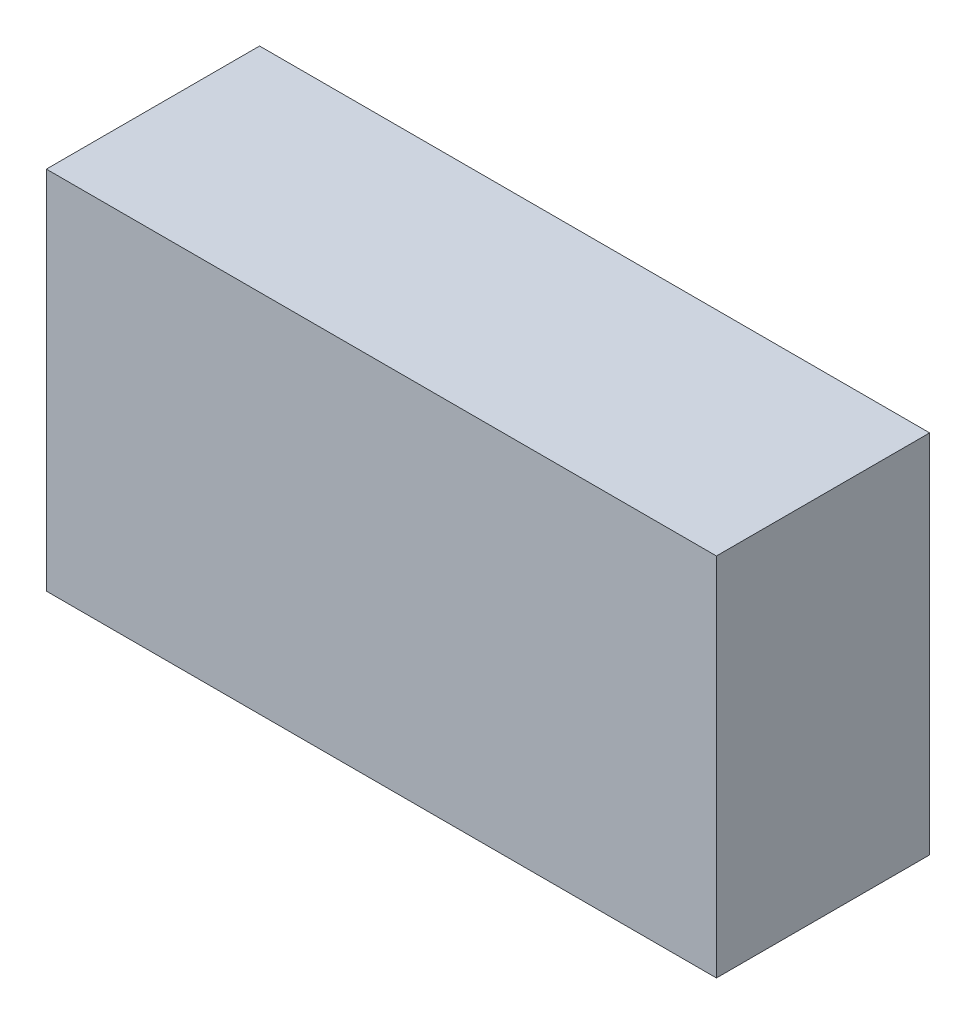
ISO-10303-21;
HEADER;
FILE_DESCRIPTION(('STEP AP214'),'2;1');
FILE_NAME('part.step','',(''),(''),'','','');
FILE_SCHEMA(('AUTOMOTIVE_DESIGN { 1 0 10303 214 1 1 1 1 }'));
ENDSEC;
DATA;
#1=APPLICATION_CONTEXT('core data for automotive mechanical design processes');
#2=APPLICATION_PROTOCOL_DEFINITION('international standard','automotive_design',2000,#1);
#3=PRODUCT_CONTEXT('',#1,'mechanical');
#4=PRODUCT('Part','Part','',(#3));
#5=PRODUCT_RELATED_PRODUCT_CATEGORY('part','',(#4));
#6=PRODUCT_DEFINITION_FORMATION('','',#4);
#7=PRODUCT_DEFINITION_CONTEXT('part definition',#1,'design');
#8=PRODUCT_DEFINITION('design','',#6,#7);
#9=PRODUCT_DEFINITION_SHAPE('','',#8);
#10=(LENGTH_UNIT() NAMED_UNIT(*) SI_UNIT(.MILLI.,.METRE.));
#11=(NAMED_UNIT(*) PLANE_ANGLE_UNIT() SI_UNIT($,.RADIAN.));
#12=(NAMED_UNIT(*) SI_UNIT($,.STERADIAN.) SOLID_ANGLE_UNIT());
#13=UNCERTAINTY_MEASURE_WITH_UNIT(LENGTH_MEASURE(1.E-05),#10,'distance_accuracy_value','');
#14=(GEOMETRIC_REPRESENTATION_CONTEXT(3) GLOBAL_UNCERTAINTY_ASSIGNED_CONTEXT((#13)) GLOBAL_UNIT_ASSIGNED_CONTEXT((#10,
#11,#12)) REPRESENTATION_CONTEXT('',''));
#15=CARTESIAN_POINT('',(0.,0.,0.));
#16=DIRECTION('',(0.,0.,1.));
#17=DIRECTION('',(1.,0.,0.));
#18=AXIS2_PLACEMENT_3D('',#15,#16,#17);
#19=CARTESIAN_POINT('',(55.,30.,35.));
#20=DIRECTION('',(-1.,0.,0.));
#21=DIRECTION('',(0.,-1.,0.));
#22=AXIS2_PLACEMENT_3D('',#19,#20,#21);
#23=PLANE('',#22);
#24=DIRECTION('',(0.,1.,0.));
#25=VECTOR('',#24,1.);
#26=CARTESIAN_POINT('',(55.,30.,0.));
#27=LINE('',#26,#25);
#28=CARTESIAN_POINT('',(55.,-30.,0.));
#29=VERTEX_POINT('',#28);
#30=CARTESIAN_POINT('',(55.,30.,0.));
#31=VERTEX_POINT('',#30);
#32=EDGE_CURVE('E173',#29,#31,#27,.T.);
#33=ORIENTED_EDGE('',*,*,#32,.T.);
#34=DIRECTION('',(0.,0.,-1.));
#35=VECTOR('',#34,1.);
#36=CARTESIAN_POINT('',(55.,30.,35.));
#37=LINE('',#36,#35);
#38=CARTESIAN_POINT('',(55.,30.,35.));
#39=VERTEX_POINT('',#38);
#40=EDGE_CURVE('E191',#39,#31,#37,.T.);
#41=ORIENTED_EDGE('',*,*,#40,.F.);
#42=DIRECTION('',(0.,1.,0.));
#43=VECTOR('',#42,1.);
#44=CARTESIAN_POINT('',(55.,30.,35.));
#45=LINE('',#44,#43);
#46=CARTESIAN_POINT('',(55.,-30.,35.));
#47=VERTEX_POINT('',#46);
#48=EDGE_CURVE('E179',#47,#39,#45,.T.);
#49=ORIENTED_EDGE('',*,*,#48,.F.);
#50=DIRECTION('',(0.,0.,-1.));
#51=VECTOR('',#50,1.);
#52=CARTESIAN_POINT('',(55.,-30.,35.));
#53=LINE('',#52,#51);
#54=EDGE_CURVE('E180',#47,#29,#53,.T.);
#55=ORIENTED_EDGE('',*,*,#54,.T.);
#56=EDGE_LOOP('',(#33,#41,#49,#55));
#57=FACE_BOUND('',#56,.T.);
#58=ADVANCED_FACE('F39',(#57),#23,.F.);
#59=CARTESIAN_POINT('',(-55.,30.,35.));
#60=DIRECTION('',(0.,-1.,0.));
#61=DIRECTION('',(0.,0.,-1.));
#62=AXIS2_PLACEMENT_3D('',#59,#60,#61);
#63=PLANE('',#62);
#64=DIRECTION('',(-1.,0.,0.));
#65=VECTOR('',#64,1.);
#66=CARTESIAN_POINT('',(-55.,30.,0.));
#67=LINE('',#66,#65);
#68=CARTESIAN_POINT('',(-55.,30.,0.));
#69=VERTEX_POINT('',#68);
#70=EDGE_CURVE('E169',#31,#69,#67,.T.);
#71=ORIENTED_EDGE('',*,*,#70,.T.);
#72=DIRECTION('',(0.,0.,-1.));
#73=VECTOR('',#72,1.);
#74=CARTESIAN_POINT('',(-55.,30.,35.));
#75=LINE('',#74,#73);
#76=CARTESIAN_POINT('',(-55.,30.,35.));
#77=VERTEX_POINT('',#76);
#78=EDGE_CURVE('E188',#77,#69,#75,.T.);
#79=ORIENTED_EDGE('',*,*,#78,.F.);
#80=DIRECTION('',(-1.,0.,0.));
#81=VECTOR('',#80,1.);
#82=CARTESIAN_POINT('',(-55.,30.,35.));
#83=LINE('',#82,#81);
#84=EDGE_CURVE('E282',#39,#77,#83,.T.);
#85=ORIENTED_EDGE('',*,*,#84,.F.);
#86=ORIENTED_EDGE('',*,*,#40,.T.);
#87=EDGE_LOOP('',(#71,#79,#85,#86));
#88=FACE_BOUND('',#87,.T.);
#89=ADVANCED_FACE('F297',(#88),#63,.F.);
#90=CARTESIAN_POINT('',(-55.,30.,35.));
#91=DIRECTION('',(1.,0.,0.));
#92=DIRECTION('',(0.,1.,0.));
#93=AXIS2_PLACEMENT_3D('',#90,#91,#92);
#94=PLANE('',#93);
#95=DIRECTION('',(0.,-1.,0.));
#96=VECTOR('',#95,1.);
#97=CARTESIAN_POINT('',(-55.,0.,7.));
#98=LINE('',#97,#96);
#99=CARTESIAN_POINT('',(-55.,15.,7.));
#100=VERTEX_POINT('',#99);
#101=CARTESIAN_POINT('',(-55.,10.,7.));
#102=VERTEX_POINT('',#101);
#103=EDGE_CURVE('E426',#100,#102,#98,.T.);
#104=ORIENTED_EDGE('',*,*,#103,.F.);
#105=DIRECTION('',(0.,0.,-1.));
#106=VECTOR('',#105,1.);
#107=CARTESIAN_POINT('',(-55.,15.,0.));
#108=LINE('',#107,#106);
#109=CARTESIAN_POINT('',(-55.,15.,16.));
#110=VERTEX_POINT('',#109);
#111=EDGE_CURVE('E54',#110,#100,#108,.T.);
#112=ORIENTED_EDGE('',*,*,#111,.F.);
#113=DIRECTION('',(0.,-1.,0.));
#114=VECTOR('',#113,1.);
#115=CARTESIAN_POINT('',(-55.,0.,16.));
#116=LINE('',#115,#114);
#117=CARTESIAN_POINT('',(-55.,10.,16.));
#118=VERTEX_POINT('',#117);
#119=EDGE_CURVE('E217',#110,#118,#116,.T.);
#120=ORIENTED_EDGE('',*,*,#119,.T.);
#121=DIRECTION('',(0.,0.,-1.));
#122=VECTOR('',#121,1.);
#123=CARTESIAN_POINT('',(-55.,10.,0.));
#124=LINE('',#123,#122);
#125=EDGE_CURVE('E226',#118,#102,#124,.T.);
#126=ORIENTED_EDGE('',*,*,#125,.T.);
#127=EDGE_LOOP('',(#104,#112,#120,#126));
#128=FACE_BOUND('',#127,.T.);
#129=DIRECTION('',(0.,-1.,0.));
#130=VECTOR('',#129,1.);
#131=CARTESIAN_POINT('',(-55.,30.,0.));
#132=LINE('',#131,#130);
#133=CARTESIAN_POINT('',(-55.,-10.5,0.));
#134=VERTEX_POINT('',#133);
#135=EDGE_CURVE('E159',#69,#134,#132,.T.);
#136=ORIENTED_EDGE('',*,*,#135,.T.);
#137=CARTESIAN_POINT('',(-55.,-13.,0.));
#138=DIRECTION('',(-1.,0.,0.));
#139=DIRECTION('',(0.,-1.,0.));
#140=AXIS2_PLACEMENT_3D('',#137,#138,#139);
#141=CIRCLE('',#140,2.5);
#142=CARTESIAN_POINT('',(-55.,-15.5,0.));
#143=VERTEX_POINT('',#142);
#144=EDGE_CURVE('E142',#143,#134,#141,.T.);
#145=ORIENTED_EDGE('',*,*,#144,.F.);
#146=CARTESIAN_POINT('',(-55.,-30.,0.));
#147=VERTEX_POINT('',#146);
#148=EDGE_CURVE('E155',#143,#147,#132,.T.);
#149=ORIENTED_EDGE('',*,*,#148,.T.);
#150=DIRECTION('',(0.,0.,-1.));
#151=VECTOR('',#150,1.);
#152=CARTESIAN_POINT('',(-55.,-30.,35.));
#153=LINE('',#152,#151);
#154=CARTESIAN_POINT('',(-55.,-30.,35.));
#155=VERTEX_POINT('',#154);
#156=EDGE_CURVE('E184',#155,#147,#153,.T.);
#157=ORIENTED_EDGE('',*,*,#156,.F.);
#158=DIRECTION('',(0.,-1.,0.));
#159=VECTOR('',#158,1.);
#160=CARTESIAN_POINT('',(-55.,30.,35.));
#161=LINE('',#160,#159);
#162=EDGE_CURVE('E285',#77,#155,#161,.T.);
#163=ORIENTED_EDGE('',*,*,#162,.F.);
#164=ORIENTED_EDGE('',*,*,#78,.T.);
#165=EDGE_LOOP('',(#136,#145,#149,#157,#163,#164));
#166=FACE_BOUND('',#165,.T.);
#167=ADVANCED_FACE('F153',(#128,#166),#94,.F.);
#168=CARTESIAN_POINT('',(-55.,-30.,35.));
#169=DIRECTION('',(0.,1.,0.));
#170=DIRECTION('',(0.,0.,1.));
#171=AXIS2_PLACEMENT_3D('',#168,#169,#170);
#172=PLANE('',#171);
#173=DIRECTION('',(1.,0.,0.));
#174=VECTOR('',#173,1.);
#175=CARTESIAN_POINT('',(-55.,-30.,0.));
#176=LINE('',#175,#174);
#177=EDGE_CURVE('E167',#147,#29,#176,.T.);
#178=ORIENTED_EDGE('',*,*,#177,.T.);
#179=ORIENTED_EDGE('',*,*,#54,.F.);
#180=DIRECTION('',(1.,0.,0.));
#181=VECTOR('',#180,1.);
#182=CARTESIAN_POINT('',(-55.,-30.,35.));
#183=LINE('',#182,#181);
#184=EDGE_CURVE('E185',#155,#47,#183,.T.);
#185=ORIENTED_EDGE('',*,*,#184,.F.);
#186=ORIENTED_EDGE('',*,*,#156,.T.);
#187=EDGE_LOOP('',(#178,#179,#185,#186));
#188=FACE_BOUND('',#187,.T.);
#189=ADVANCED_FACE('F303',(#188),#172,.F.);
#190=CARTESIAN_POINT('',(0.,0.,35.));
#191=DIRECTION('',(0.,0.,1.));
#192=DIRECTION('',(1.,0.,0.));
#193=AXIS2_PLACEMENT_3D('',#190,#191,#192);
#194=PLANE('',#193);
#195=ORIENTED_EDGE('',*,*,#48,.T.);
#196=ORIENTED_EDGE('',*,*,#84,.T.);
#197=ORIENTED_EDGE('',*,*,#162,.T.);
#198=ORIENTED_EDGE('',*,*,#184,.T.);
#199=EDGE_LOOP('',(#195,#196,#197,#198));
#200=FACE_BOUND('',#199,.T.);
#201=ADVANCED_FACE('F300',(#200),#194,.T.);
#202=CARTESIAN_POINT('',(0.,0.,0.));
#203=DIRECTION('',(0.,0.,1.));
#204=DIRECTION('',(1.,0.,0.));
#205=AXIS2_PLACEMENT_3D('',#202,#203,#204);
#206=PLANE('',#205);
#207=DIRECTION('',(0.,-1.,0.));
#208=VECTOR('',#207,1.);
#209=CARTESIAN_POINT('',(-53.5,30.,0.));
#210=LINE('',#209,#208);
#211=CARTESIAN_POINT('',(-53.5,28.5,0.));
#212=VERTEX_POINT('',#211);
#213=CARTESIAN_POINT('',(-53.5,-10.5,0.));
#214=VERTEX_POINT('',#213);
#215=EDGE_CURVE('E272',#212,#214,#210,.T.);
#216=ORIENTED_EDGE('',*,*,#215,.T.);
#217=DIRECTION('',(-1.,0.,0.));
#218=VECTOR('',#217,1.);
#219=CARTESIAN_POINT('',(-20.,-10.5,0.));
#220=LINE('',#219,#218);
#221=EDGE_CURVE('E149',#214,#134,#220,.T.);
#222=ORIENTED_EDGE('',*,*,#221,.T.);
#223=ORIENTED_EDGE('',*,*,#135,.F.);
#224=ORIENTED_EDGE('',*,*,#70,.F.);
#225=ORIENTED_EDGE('',*,*,#32,.F.);
#226=ORIENTED_EDGE('',*,*,#177,.F.);
#227=ORIENTED_EDGE('',*,*,#148,.F.);
#228=DIRECTION('',(-1.,0.,0.));
#229=VECTOR('',#228,1.);
#230=CARTESIAN_POINT('',(-20.,-15.5,0.));
#231=LINE('',#230,#229);
#232=CARTESIAN_POINT('',(-53.5,-15.5,0.));
#233=VERTEX_POINT('',#232);
#234=EDGE_CURVE('E139',#233,#143,#231,.T.);
#235=ORIENTED_EDGE('',*,*,#234,.F.);
#236=CARTESIAN_POINT('',(-53.5,-28.5,0.));
#237=VERTEX_POINT('',#236);
#238=EDGE_CURVE('E275',#233,#237,#210,.T.);
#239=ORIENTED_EDGE('',*,*,#238,.T.);
#240=DIRECTION('',(1.,0.,0.));
#241=VECTOR('',#240,1.);
#242=CARTESIAN_POINT('',(-55.,-28.5,0.));
#243=LINE('',#242,#241);
#244=CARTESIAN_POINT('',(53.5,-28.5,0.));
#245=VERTEX_POINT('',#244);
#246=EDGE_CURVE('E245',#237,#245,#243,.T.);
#247=ORIENTED_EDGE('',*,*,#246,.T.);
#248=DIRECTION('',(0.,1.,0.));
#249=VECTOR('',#248,1.);
#250=CARTESIAN_POINT('',(53.5,30.,0.));
#251=LINE('',#250,#249);
#252=CARTESIAN_POINT('',(53.5,28.5,0.));
#253=VERTEX_POINT('',#252);
#254=EDGE_CURVE('E264',#245,#253,#251,.T.);
#255=ORIENTED_EDGE('',*,*,#254,.T.);
#256=DIRECTION('',(-1.,0.,0.));
#257=VECTOR('',#256,1.);
#258=CARTESIAN_POINT('',(-55.,28.5,0.));
#259=LINE('',#258,#257);
#260=EDGE_CURVE('E268',#253,#212,#259,.T.);
#261=ORIENTED_EDGE('',*,*,#260,.T.);
#262=EDGE_LOOP('',(#216,#222,#223,#224,#225,#226,#227,#235,#239,#247,#255,#261));
#263=FACE_BOUND('',#262,.T.);
#264=ADVANCED_FACE('F165',(#263),#206,.F.);
#265=CARTESIAN_POINT('',(53.5,30.,35.));
#266=DIRECTION('',(-1.,0.,0.));
#267=DIRECTION('',(0.,-1.,0.));
#268=AXIS2_PLACEMENT_3D('',#265,#266,#267);
#269=PLANE('',#268);
#270=ORIENTED_EDGE('',*,*,#254,.F.);
#271=DIRECTION('',(0.,0.,-1.));
#272=VECTOR('',#271,1.);
#273=CARTESIAN_POINT('',(53.5,-28.5,35.));
#274=LINE('',#273,#272);
#275=CARTESIAN_POINT('',(53.5,-28.5,33.5));
#276=VERTEX_POINT('',#275);
#277=EDGE_CURVE('E246',#276,#245,#274,.T.);
#278=ORIENTED_EDGE('',*,*,#277,.F.);
#279=DIRECTION('',(0.,1.,0.));
#280=VECTOR('',#279,1.);
#281=CARTESIAN_POINT('',(53.5,30.,33.5));
#282=LINE('',#281,#280);
#283=CARTESIAN_POINT('',(53.5,28.5,33.5));
#284=VERTEX_POINT('',#283);
#285=EDGE_CURVE('E240',#276,#284,#282,.T.);
#286=ORIENTED_EDGE('',*,*,#285,.T.);
#287=DIRECTION('',(0.,0.,-1.));
#288=VECTOR('',#287,1.);
#289=CARTESIAN_POINT('',(53.5,28.5,35.));
#290=LINE('',#289,#288);
#291=EDGE_CURVE('E235',#284,#253,#290,.T.);
#292=ORIENTED_EDGE('',*,*,#291,.T.);
#293=EDGE_LOOP('',(#270,#278,#286,#292));
#294=FACE_BOUND('',#293,.T.);
#295=ADVANCED_FACE('F340',(#294),#269,.T.);
#296=CARTESIAN_POINT('',(-55.,28.5,35.));
#297=DIRECTION('',(0.,-1.,0.));
#298=DIRECTION('',(0.,0.,-1.));
#299=AXIS2_PLACEMENT_3D('',#296,#297,#298);
#300=PLANE('',#299);
#301=ORIENTED_EDGE('',*,*,#260,.F.);
#302=ORIENTED_EDGE('',*,*,#291,.F.);
#303=DIRECTION('',(-1.,0.,0.));
#304=VECTOR('',#303,1.);
#305=CARTESIAN_POINT('',(-55.,28.5,33.5));
#306=LINE('',#305,#304);
#307=CARTESIAN_POINT('',(-53.5,28.5,33.5));
#308=VERTEX_POINT('',#307);
#309=EDGE_CURVE('E244',#284,#308,#306,.T.);
#310=ORIENTED_EDGE('',*,*,#309,.T.);
#311=DIRECTION('',(0.,0.,-1.));
#312=VECTOR('',#311,1.);
#313=CARTESIAN_POINT('',(-53.5,28.5,35.));
#314=LINE('',#313,#312);
#315=EDGE_CURVE('E239',#308,#212,#314,.T.);
#316=ORIENTED_EDGE('',*,*,#315,.T.);
#317=EDGE_LOOP('',(#301,#302,#310,#316));
#318=FACE_BOUND('',#317,.T.);
#319=ADVANCED_FACE('F352',(#318),#300,.T.);
#320=CARTESIAN_POINT('',(-53.5,30.,35.));
#321=DIRECTION('',(1.,0.,0.));
#322=DIRECTION('',(0.,1.,0.));
#323=AXIS2_PLACEMENT_3D('',#320,#321,#322);
#324=PLANE('',#323);
#325=CARTESIAN_POINT('',(-53.5,-13.,0.));
#326=DIRECTION('',(1.,0.,0.));
#327=DIRECTION('',(0.,1.,0.));
#328=AXIS2_PLACEMENT_3D('',#325,#326,#327);
#329=CIRCLE('',#328,2.5);
#330=EDGE_CURVE('E11',#214,#233,#329,.T.);
#331=ORIENTED_EDGE('',*,*,#330,.F.);
#332=ORIENTED_EDGE('',*,*,#215,.F.);
#333=ORIENTED_EDGE('',*,*,#315,.F.);
#334=DIRECTION('',(0.,-1.,0.));
#335=VECTOR('',#334,1.);
#336=CARTESIAN_POINT('',(-53.5,30.,33.5));
#337=LINE('',#336,#335);
#338=CARTESIAN_POINT('',(-53.5,-28.5,33.5));
#339=VERTEX_POINT('',#338);
#340=EDGE_CURVE('E256',#308,#339,#337,.T.);
#341=ORIENTED_EDGE('',*,*,#340,.T.);
#342=DIRECTION('',(0.,0.,-1.));
#343=VECTOR('',#342,1.);
#344=CARTESIAN_POINT('',(-53.5,-28.5,35.));
#345=LINE('',#344,#343);
#346=EDGE_CURVE('E249',#339,#237,#345,.T.);
#347=ORIENTED_EDGE('',*,*,#346,.T.);
#348=ORIENTED_EDGE('',*,*,#238,.F.);
#349=EDGE_LOOP('',(#331,#332,#333,#341,#347,#348));
#350=FACE_BOUND('',#349,.T.);
#351=DIRECTION('',(0.,0.,1.));
#352=VECTOR('',#351,1.);
#353=CARTESIAN_POINT('',(-53.5,15.,35.));
#354=LINE('',#353,#352);
#355=CARTESIAN_POINT('',(-53.5,15.,7.));
#356=VERTEX_POINT('',#355);
#357=CARTESIAN_POINT('',(-53.5,15.,16.));
#358=VERTEX_POINT('',#357);
#359=EDGE_CURVE('E47',#356,#358,#354,.T.);
#360=ORIENTED_EDGE('',*,*,#359,.F.);
#361=DIRECTION('',(0.,1.,0.));
#362=VECTOR('',#361,1.);
#363=CARTESIAN_POINT('',(-53.5,30.,7.));
#364=LINE('',#363,#362);
#365=CARTESIAN_POINT('',(-53.5,10.,7.));
#366=VERTEX_POINT('',#365);
#367=EDGE_CURVE('E195',#366,#356,#364,.T.);
#368=ORIENTED_EDGE('',*,*,#367,.F.);
#369=DIRECTION('',(0.,0.,1.));
#370=VECTOR('',#369,1.);
#371=CARTESIAN_POINT('',(-53.5,10.,35.));
#372=LINE('',#371,#370);
#373=CARTESIAN_POINT('',(-53.5,10.,16.));
#374=VERTEX_POINT('',#373);
#375=EDGE_CURVE('E198',#366,#374,#372,.T.);
#376=ORIENTED_EDGE('',*,*,#375,.T.);
#377=DIRECTION('',(0.,1.,0.));
#378=VECTOR('',#377,1.);
#379=CARTESIAN_POINT('',(-53.5,30.,16.));
#380=LINE('',#379,#378);
#381=EDGE_CURVE('E202',#374,#358,#380,.T.);
#382=ORIENTED_EDGE('',*,*,#381,.T.);
#383=EDGE_LOOP('',(#360,#368,#376,#382));
#384=FACE_BOUND('',#383,.T.);
#385=ADVANCED_FACE('F221',(#350,#384),#324,.T.);
#386=CARTESIAN_POINT('',(-55.,-28.5,35.));
#387=DIRECTION('',(0.,1.,0.));
#388=DIRECTION('',(0.,0.,1.));
#389=AXIS2_PLACEMENT_3D('',#386,#387,#388);
#390=PLANE('',#389);
#391=ORIENTED_EDGE('',*,*,#246,.F.);
#392=ORIENTED_EDGE('',*,*,#346,.F.);
#393=DIRECTION('',(1.,0.,0.));
#394=VECTOR('',#393,1.);
#395=CARTESIAN_POINT('',(-55.,-28.5,33.5));
#396=LINE('',#395,#394);
#397=EDGE_CURVE('E250',#339,#276,#396,.T.);
#398=ORIENTED_EDGE('',*,*,#397,.T.);
#399=ORIENTED_EDGE('',*,*,#277,.T.);
#400=EDGE_LOOP('',(#391,#392,#398,#399));
#401=FACE_BOUND('',#400,.T.);
#402=ADVANCED_FACE('F351',(#401),#390,.T.);
#403=CARTESIAN_POINT('',(0.,0.,33.5));
#404=DIRECTION('',(0.,0.,1.));
#405=DIRECTION('',(1.,0.,0.));
#406=AXIS2_PLACEMENT_3D('',#403,#404,#405);
#407=PLANE('',#406);
#408=ORIENTED_EDGE('',*,*,#285,.F.);
#409=ORIENTED_EDGE('',*,*,#397,.F.);
#410=ORIENTED_EDGE('',*,*,#340,.F.);
#411=ORIENTED_EDGE('',*,*,#309,.F.);
#412=EDGE_LOOP('',(#408,#409,#410,#411));
#413=FACE_BOUND('',#412,.T.);
#414=ADVANCED_FACE('F331',(#413),#407,.F.);
#415=CARTESIAN_POINT('',(-20.,15.,0.));
#416=DIRECTION('',(0.,1.,0.));
#417=DIRECTION('',(-1.,0.,0.));
#418=AXIS2_PLACEMENT_3D('',#415,#416,#417);
#419=PLANE('',#418);
#420=ORIENTED_EDGE('',*,*,#359,.T.);
#421=DIRECTION('',(-1.,0.,0.));
#422=VECTOR('',#421,1.);
#423=CARTESIAN_POINT('',(-20.,15.,16.));
#424=LINE('',#423,#422);
#425=EDGE_CURVE('E161',#358,#110,#424,.T.);
#426=ORIENTED_EDGE('',*,*,#425,.T.);
#427=ORIENTED_EDGE('',*,*,#111,.T.);
#428=DIRECTION('',(-1.,0.,0.));
#429=VECTOR('',#428,1.);
#430=CARTESIAN_POINT('',(-20.,15.,7.));
#431=LINE('',#430,#429);
#432=EDGE_CURVE('E210',#356,#100,#431,.T.);
#433=ORIENTED_EDGE('',*,*,#432,.F.);
#434=EDGE_LOOP('',(#420,#426,#427,#433));
#435=FACE_BOUND('',#434,.T.);
#436=ADVANCED_FACE('F208',(#435),#419,.F.);
#437=CARTESIAN_POINT('',(-20.,0.,16.));
#438=DIRECTION('',(0.,0.,-1.));
#439=DIRECTION('',(-1.,0.,0.));
#440=AXIS2_PLACEMENT_3D('',#437,#438,#439);
#441=PLANE('',#440);
#442=DIRECTION('',(-1.,0.,0.));
#443=VECTOR('',#442,1.);
#444=CARTESIAN_POINT('',(-20.,10.,16.));
#445=LINE('',#444,#443);
#446=EDGE_CURVE('E219',#374,#118,#445,.T.);
#447=ORIENTED_EDGE('',*,*,#446,.T.);
#448=ORIENTED_EDGE('',*,*,#119,.F.);
#449=ORIENTED_EDGE('',*,*,#425,.F.);
#450=ORIENTED_EDGE('',*,*,#381,.F.);
#451=EDGE_LOOP('',(#447,#448,#449,#450));
#452=FACE_BOUND('',#451,.T.);
#453=ADVANCED_FACE('F214',(#452),#441,.T.);
#454=CARTESIAN_POINT('',(-20.,10.,0.));
#455=DIRECTION('',(0.,1.,0.));
#456=DIRECTION('',(-1.,0.,0.));
#457=AXIS2_PLACEMENT_3D('',#454,#455,#456);
#458=PLANE('',#457);
#459=DIRECTION('',(-1.,0.,0.));
#460=VECTOR('',#459,1.);
#461=CARTESIAN_POINT('',(-20.,10.,7.));
#462=LINE('',#461,#460);
#463=EDGE_CURVE('E62',#366,#102,#462,.T.);
#464=ORIENTED_EDGE('',*,*,#463,.T.);
#465=ORIENTED_EDGE('',*,*,#125,.F.);
#466=ORIENTED_EDGE('',*,*,#446,.F.);
#467=ORIENTED_EDGE('',*,*,#375,.F.);
#468=EDGE_LOOP('',(#464,#465,#466,#467));
#469=FACE_BOUND('',#468,.T.);
#470=ADVANCED_FACE('F223',(#469),#458,.T.);
#471=CARTESIAN_POINT('',(-20.,0.,7.));
#472=DIRECTION('',(0.,0.,-1.));
#473=DIRECTION('',(0.,1.,0.));
#474=AXIS2_PLACEMENT_3D('',#471,#472,#473);
#475=PLANE('',#474);
#476=ORIENTED_EDGE('',*,*,#367,.T.);
#477=ORIENTED_EDGE('',*,*,#432,.T.);
#478=ORIENTED_EDGE('',*,*,#103,.T.);
#479=ORIENTED_EDGE('',*,*,#463,.F.);
#480=EDGE_LOOP('',(#476,#477,#478,#479));
#481=FACE_BOUND('',#480,.T.);
#482=ADVANCED_FACE('F382',(#481),#475,.F.);
#483=CARTESIAN_POINT('',(-20.,-13.,0.));
#484=DIRECTION('',(-1.,0.,0.));
#485=DIRECTION('',(0.,-1.,0.));
#486=AXIS2_PLACEMENT_3D('',#483,#484,#485);
#487=CYLINDRICAL_SURFACE('',#486,2.5);
#488=ORIENTED_EDGE('',*,*,#330,.T.);
#489=ORIENTED_EDGE('',*,*,#234,.T.);
#490=ORIENTED_EDGE('',*,*,#144,.T.);
#491=ORIENTED_EDGE('',*,*,#221,.F.);
#492=EDGE_LOOP('',(#488,#489,#490,#491));
#493=FACE_BOUND('',#492,.T.);
#494=ADVANCED_FACE('F141',(#493),#487,.F.);
#495=CLOSED_SHELL('',(#58,#89,#167,#189,#201,#264,#295,#319,#385,#402,#414,#436,#453,#470,#482,#494));
#496=MANIFOLD_SOLID_BREP('B2',#495);
#497=ADVANCED_BREP_SHAPE_REPRESENTATION('',(#18,#496),#14);
#498=SHAPE_DEFINITION_REPRESENTATION(#9,#497);
ENDSEC;
END-ISO-10303-21;
